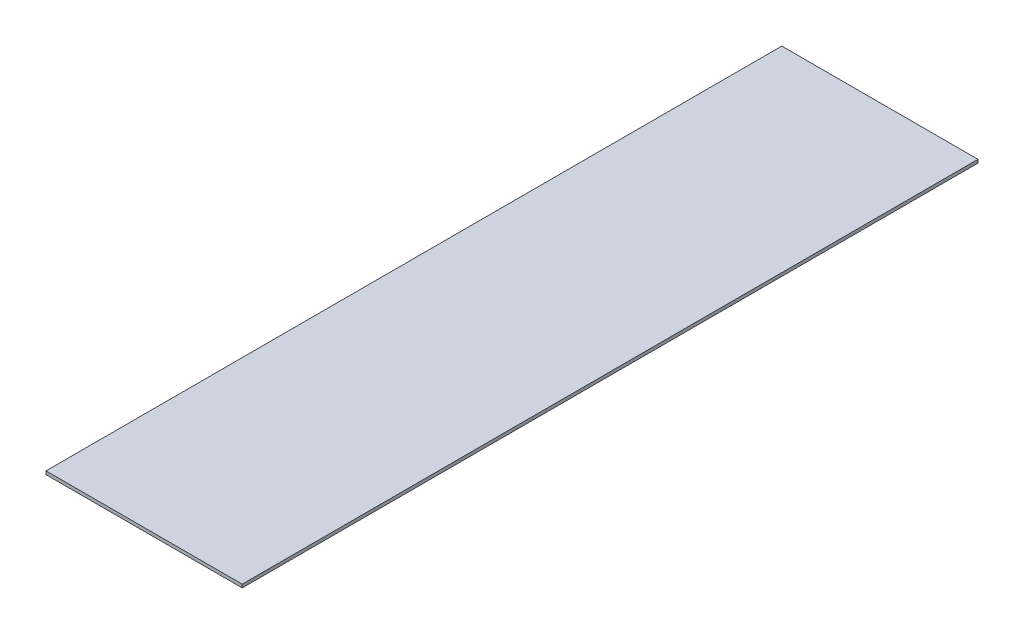
ISO-10303-21;
HEADER;
FILE_DESCRIPTION(('STEP AP214'),'2;1');
FILE_NAME('part.step','',(''),(''),'','','');
FILE_SCHEMA(('AUTOMOTIVE_DESIGN { 1 0 10303 214 1 1 1 1 }'));
ENDSEC;
DATA;
#1=APPLICATION_CONTEXT('core data for automotive mechanical design processes');
#2=APPLICATION_PROTOCOL_DEFINITION('international standard','automotive_design',2000,#1);
#3=PRODUCT_CONTEXT('',#1,'mechanical');
#4=PRODUCT('Part','Part','',(#3));
#5=PRODUCT_RELATED_PRODUCT_CATEGORY('part','',(#4));
#6=PRODUCT_DEFINITION_FORMATION('','',#4);
#7=PRODUCT_DEFINITION_CONTEXT('part definition',#1,'design');
#8=PRODUCT_DEFINITION('design','',#6,#7);
#9=PRODUCT_DEFINITION_SHAPE('','',#8);
#10=(LENGTH_UNIT() NAMED_UNIT(*) SI_UNIT(.MILLI.,.METRE.));
#11=(NAMED_UNIT(*) PLANE_ANGLE_UNIT() SI_UNIT($,.RADIAN.));
#12=(NAMED_UNIT(*) SI_UNIT($,.STERADIAN.) SOLID_ANGLE_UNIT());
#13=UNCERTAINTY_MEASURE_WITH_UNIT(LENGTH_MEASURE(1.E-05),#10,'distance_accuracy_value','');
#14=(GEOMETRIC_REPRESENTATION_CONTEXT(3) GLOBAL_UNCERTAINTY_ASSIGNED_CONTEXT((#13)) GLOBAL_UNIT_ASSIGNED_CONTEXT((#10,
#11,#12)) REPRESENTATION_CONTEXT('',''));
#15=CARTESIAN_POINT('',(0.,0.,0.));
#16=DIRECTION('',(0.,0.,1.));
#17=DIRECTION('',(1.,0.,0.));
#18=AXIS2_PLACEMENT_3D('',#15,#16,#17);
#19=CARTESIAN_POINT('',(-20.,2.,-159.659090909091));
#20=DIRECTION('',(1.,0.,0.));
#21=DIRECTION('',(0.,0.,-1.));
#22=AXIS2_PLACEMENT_3D('',#19,#20,#21);
#23=PLANE('',#22);
#24=DIRECTION('',(0.,0.,1.));
#25=VECTOR('',#24,1.);
#26=CARTESIAN_POINT('',(-20.,0.,-159.659090909091));
#27=LINE('',#26,#25);
#28=CARTESIAN_POINT('',(-20.,0.,-159.659090909091));
#29=VERTEX_POINT('',#28);
#30=CARTESIAN_POINT('',(-20.,0.,290.340909090909));
#31=VERTEX_POINT('',#30);
#32=EDGE_CURVE('E98',#29,#31,#27,.T.);
#33=ORIENTED_EDGE('',*,*,#32,.T.);
#34=DIRECTION('',(0.,-1.,0.));
#35=VECTOR('',#34,1.);
#36=CARTESIAN_POINT('',(-20.,2.,290.340909090909));
#37=LINE('',#36,#35);
#38=CARTESIAN_POINT('',(-20.,2.,290.340909090909));
#39=VERTEX_POINT('',#38);
#40=EDGE_CURVE('E11',#39,#31,#37,.T.);
#41=ORIENTED_EDGE('',*,*,#40,.F.);
#42=DIRECTION('',(0.,0.,1.));
#43=VECTOR('',#42,1.);
#44=CARTESIAN_POINT('',(-20.,2.,-159.659090909091));
#45=LINE('',#44,#43);
#46=CARTESIAN_POINT('',(-20.,2.,-159.659090909091));
#47=VERTEX_POINT('',#46);
#48=EDGE_CURVE('E86',#47,#39,#45,.T.);
#49=ORIENTED_EDGE('',*,*,#48,.F.);
#50=DIRECTION('',(0.,-1.,0.));
#51=VECTOR('',#50,1.);
#52=CARTESIAN_POINT('',(-20.,2.,-159.659090909091));
#53=LINE('',#52,#51);
#54=EDGE_CURVE('E94',#47,#29,#53,.T.);
#55=ORIENTED_EDGE('',*,*,#54,.T.);
#56=EDGE_LOOP('',(#33,#41,#49,#55));
#57=FACE_BOUND('',#56,.T.);
#58=ADVANCED_FACE('F35',(#57),#23,.F.);
#59=CARTESIAN_POINT('',(-20.,2.,290.340909090909));
#60=DIRECTION('',(0.,0.,-1.));
#61=DIRECTION('',(-1.,0.,0.));
#62=AXIS2_PLACEMENT_3D('',#59,#60,#61);
#63=PLANE('',#62);
#64=DIRECTION('',(1.,0.,0.));
#65=VECTOR('',#64,1.);
#66=CARTESIAN_POINT('',(-20.,0.,290.340909090909));
#67=LINE('',#66,#65);
#68=CARTESIAN_POINT('',(100.,0.,290.340909090909));
#69=VERTEX_POINT('',#68);
#70=EDGE_CURVE('E90',#31,#69,#67,.T.);
#71=ORIENTED_EDGE('',*,*,#70,.T.);
#72=DIRECTION('',(0.,-1.,0.));
#73=VECTOR('',#72,1.);
#74=CARTESIAN_POINT('',(100.,2.,290.340909090909));
#75=LINE('',#74,#73);
#76=CARTESIAN_POINT('',(100.,2.,290.340909090909));
#77=VERTEX_POINT('',#76);
#78=EDGE_CURVE('E43',#77,#69,#75,.T.);
#79=ORIENTED_EDGE('',*,*,#78,.F.);
#80=DIRECTION('',(1.,0.,0.));
#81=VECTOR('',#80,1.);
#82=CARTESIAN_POINT('',(-20.,2.,290.340909090909));
#83=LINE('',#82,#81);
#84=EDGE_CURVE('E81',#39,#77,#83,.T.);
#85=ORIENTED_EDGE('',*,*,#84,.F.);
#86=ORIENTED_EDGE('',*,*,#40,.T.);
#87=EDGE_LOOP('',(#71,#79,#85,#86));
#88=FACE_BOUND('',#87,.T.);
#89=ADVANCED_FACE('F89',(#88),#63,.F.);
#90=CARTESIAN_POINT('',(100.,2.,-159.659090909091));
#91=DIRECTION('',(-1.,0.,0.));
#92=DIRECTION('',(0.,0.,1.));
#93=AXIS2_PLACEMENT_3D('',#90,#91,#92);
#94=PLANE('',#93);
#95=DIRECTION('',(0.,0.,-1.));
#96=VECTOR('',#95,1.);
#97=CARTESIAN_POINT('',(100.,0.,-159.659090909091));
#98=LINE('',#97,#96);
#99=CARTESIAN_POINT('',(100.,0.,-159.659090909091));
#100=VERTEX_POINT('',#99);
#101=EDGE_CURVE('E68',#69,#100,#98,.T.);
#102=ORIENTED_EDGE('',*,*,#101,.T.);
#103=DIRECTION('',(0.,-1.,0.));
#104=VECTOR('',#103,1.);
#105=CARTESIAN_POINT('',(100.,2.,-159.659090909091));
#106=LINE('',#105,#104);
#107=CARTESIAN_POINT('',(100.,2.,-159.659090909091));
#108=VERTEX_POINT('',#107);
#109=EDGE_CURVE('E91',#108,#100,#106,.T.);
#110=ORIENTED_EDGE('',*,*,#109,.F.);
#111=DIRECTION('',(0.,0.,-1.));
#112=VECTOR('',#111,1.);
#113=CARTESIAN_POINT('',(100.,2.,-159.659090909091));
#114=LINE('',#113,#112);
#115=EDGE_CURVE('E84',#77,#108,#114,.T.);
#116=ORIENTED_EDGE('',*,*,#115,.F.);
#117=ORIENTED_EDGE('',*,*,#78,.T.);
#118=EDGE_LOOP('',(#102,#110,#116,#117));
#119=FACE_BOUND('',#118,.T.);
#120=ADVANCED_FACE('F92',(#119),#94,.F.);
#121=CARTESIAN_POINT('',(-20.,2.,-159.659090909091));
#122=DIRECTION('',(0.,0.,1.));
#123=DIRECTION('',(1.,0.,0.));
#124=AXIS2_PLACEMENT_3D('',#121,#122,#123);
#125=PLANE('',#124);
#126=DIRECTION('',(-1.,0.,0.));
#127=VECTOR('',#126,1.);
#128=CARTESIAN_POINT('',(-20.,0.,-159.659090909091));
#129=LINE('',#128,#127);
#130=EDGE_CURVE('E74',#100,#29,#129,.T.);
#131=ORIENTED_EDGE('',*,*,#130,.T.);
#132=ORIENTED_EDGE('',*,*,#54,.F.);
#133=DIRECTION('',(-1.,0.,0.));
#134=VECTOR('',#133,1.);
#135=CARTESIAN_POINT('',(-20.,2.,-159.659090909091));
#136=LINE('',#135,#134);
#137=EDGE_CURVE('E51',#108,#47,#136,.T.);
#138=ORIENTED_EDGE('',*,*,#137,.F.);
#139=ORIENTED_EDGE('',*,*,#109,.T.);
#140=EDGE_LOOP('',(#131,#132,#138,#139));
#141=FACE_BOUND('',#140,.T.);
#142=ADVANCED_FACE('F105',(#141),#125,.F.);
#143=CARTESIAN_POINT('',(0.,2.,0.));
#144=DIRECTION('',(0.,1.,0.));
#145=DIRECTION('',(0.,0.,1.));
#146=AXIS2_PLACEMENT_3D('',#143,#144,#145);
#147=PLANE('',#146);
#148=ORIENTED_EDGE('',*,*,#48,.T.);
#149=ORIENTED_EDGE('',*,*,#84,.T.);
#150=ORIENTED_EDGE('',*,*,#115,.T.);
#151=ORIENTED_EDGE('',*,*,#137,.T.);
#152=EDGE_LOOP('',(#148,#149,#150,#151));
#153=FACE_BOUND('',#152,.T.);
#154=ADVANCED_FACE('F82',(#153),#147,.T.);
#155=CARTESIAN_POINT('',(0.,0.,0.));
#156=DIRECTION('',(0.,1.,0.));
#157=DIRECTION('',(0.,0.,1.));
#158=AXIS2_PLACEMENT_3D('',#155,#156,#157);
#159=PLANE('',#158);
#160=ORIENTED_EDGE('',*,*,#32,.F.);
#161=ORIENTED_EDGE('',*,*,#130,.F.);
#162=ORIENTED_EDGE('',*,*,#101,.F.);
#163=ORIENTED_EDGE('',*,*,#70,.F.);
#164=EDGE_LOOP('',(#160,#161,#162,#163));
#165=FACE_BOUND('',#164,.T.);
#166=ADVANCED_FACE('F108',(#165),#159,.F.);
#167=CLOSED_SHELL('',(#58,#89,#120,#142,#154,#166));
#168=MANIFOLD_SOLID_BREP('B2',#167);
#169=ADVANCED_BREP_SHAPE_REPRESENTATION('',(#18,#168),#14);
#170=SHAPE_DEFINITION_REPRESENTATION(#9,#169);
ENDSEC;
END-ISO-10303-21;
